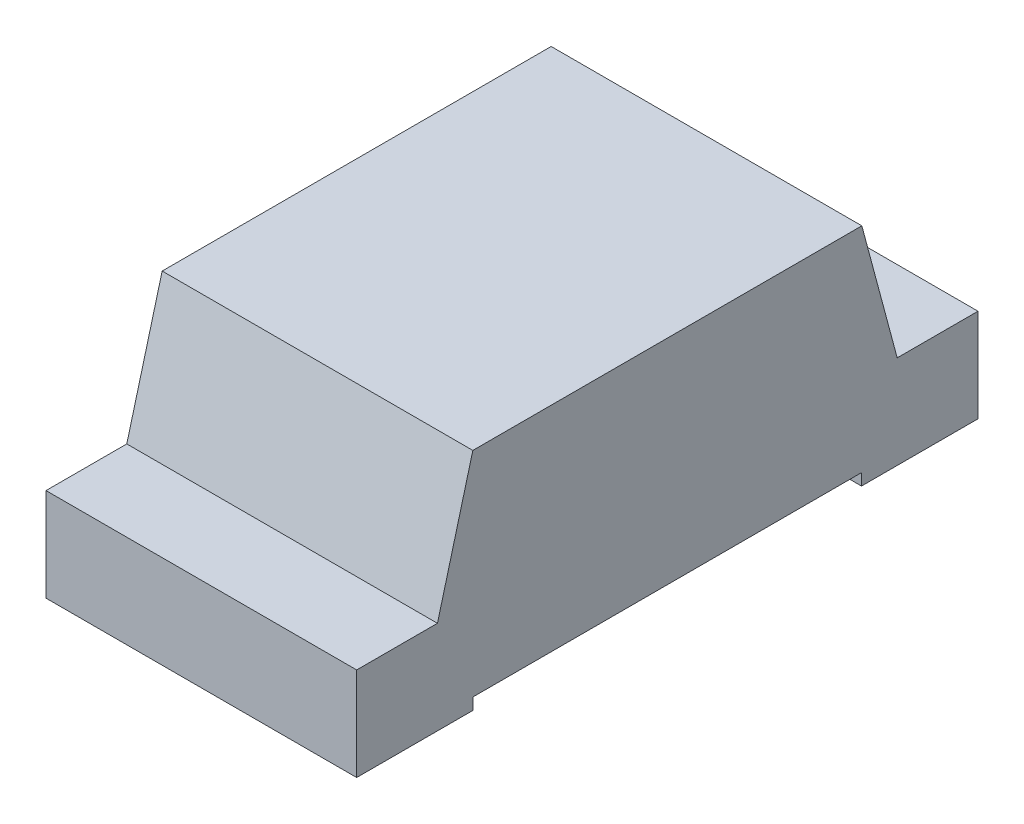
ISO-10303-21;
HEADER;
FILE_DESCRIPTION(('STEP AP214'),'2;1');
FILE_NAME('part.step','',(''),(''),'','','');
FILE_SCHEMA(('AUTOMOTIVE_DESIGN { 1 0 10303 214 1 1 1 1 }'));
ENDSEC;
DATA;
#1=APPLICATION_CONTEXT('core data for automotive mechanical design processes');
#2=APPLICATION_PROTOCOL_DEFINITION('international standard','automotive_design',2000,#1);
#3=PRODUCT_CONTEXT('',#1,'mechanical');
#4=PRODUCT('Part','Part','',(#3));
#5=PRODUCT_RELATED_PRODUCT_CATEGORY('part','',(#4));
#6=PRODUCT_DEFINITION_FORMATION('','',#4);
#7=PRODUCT_DEFINITION_CONTEXT('part definition',#1,'design');
#8=PRODUCT_DEFINITION('design','',#6,#7);
#9=PRODUCT_DEFINITION_SHAPE('','',#8);
#10=(LENGTH_UNIT() NAMED_UNIT(*) SI_UNIT(.MILLI.,.METRE.));
#11=(NAMED_UNIT(*) PLANE_ANGLE_UNIT() SI_UNIT($,.RADIAN.));
#12=(NAMED_UNIT(*) SI_UNIT($,.STERADIAN.) SOLID_ANGLE_UNIT());
#13=UNCERTAINTY_MEASURE_WITH_UNIT(LENGTH_MEASURE(1.E-05),#10,'distance_accuracy_value','');
#14=(GEOMETRIC_REPRESENTATION_CONTEXT(3) GLOBAL_UNCERTAINTY_ASSIGNED_CONTEXT((#13)) GLOBAL_UNIT_ASSIGNED_CONTEXT((#10,
#11,#12)) REPRESENTATION_CONTEXT('',''));
#15=CARTESIAN_POINT('',(0.,0.,0.));
#16=DIRECTION('',(0.,0.,1.));
#17=DIRECTION('',(1.,0.,0.));
#18=AXIS2_PLACEMENT_3D('',#15,#16,#17);
#19=CARTESIAN_POINT('',(0.4,0.,-0.5));
#20=DIRECTION('',(0.,1.,0.));
#21=DIRECTION('',(0.,0.,1.));
#22=AXIS2_PLACEMENT_3D('',#19,#20,#21);
#23=PLANE('',#22);
#24=DIRECTION('',(1.,0.,0.));
#25=VECTOR('',#24,1.);
#26=CARTESIAN_POINT('',(0.4,0.,-0.8));
#27=LINE('',#26,#25);
#28=CARTESIAN_POINT('',(-0.4,0.,-0.8));
#29=VERTEX_POINT('',#28);
#30=CARTESIAN_POINT('',(0.4,0.,-0.8));
#31=VERTEX_POINT('',#30);
#32=EDGE_CURVE('E19',#29,#31,#27,.T.);
#33=ORIENTED_EDGE('',*,*,#32,.T.);
#34=DIRECTION('',(0.,0.,-1.));
#35=VECTOR('',#34,1.);
#36=CARTESIAN_POINT('',(0.4,0.,0.));
#37=LINE('',#36,#35);
#38=CARTESIAN_POINT('',(0.4,0.,-0.5));
#39=VERTEX_POINT('',#38);
#40=EDGE_CURVE('E122',#39,#31,#37,.T.);
#41=ORIENTED_EDGE('',*,*,#40,.F.);
#42=DIRECTION('',(-1.,0.,0.));
#43=VECTOR('',#42,1.);
#44=CARTESIAN_POINT('',(0.4,0.,-0.5));
#45=LINE('',#44,#43);
#46=CARTESIAN_POINT('',(-0.4,0.,-0.5));
#47=VERTEX_POINT('',#46);
#48=EDGE_CURVE('E109',#39,#47,#45,.T.);
#49=ORIENTED_EDGE('',*,*,#48,.T.);
#50=DIRECTION('',(0.,0.,-1.));
#51=VECTOR('',#50,1.);
#52=CARTESIAN_POINT('',(-0.4,0.,0.));
#53=LINE('',#52,#51);
#54=EDGE_CURVE('E177',#47,#29,#53,.T.);
#55=ORIENTED_EDGE('',*,*,#54,.T.);
#56=EDGE_LOOP('',(#33,#41,#49,#55));
#57=FACE_BOUND('',#56,.T.);
#58=ADVANCED_FACE('F16',(#57),#23,.F.);
#59=CARTESIAN_POINT('',(0.4,0.,-0.8));
#60=DIRECTION('',(0.,0.,1.));
#61=DIRECTION('',(0.,-1.,0.));
#62=AXIS2_PLACEMENT_3D('',#59,#60,#61);
#63=PLANE('',#62);
#64=DIRECTION('',(1.,0.,0.));
#65=VECTOR('',#64,1.);
#66=CARTESIAN_POINT('',(0.4,0.24,-0.8));
#67=LINE('',#66,#65);
#68=CARTESIAN_POINT('',(-0.4,0.24,-0.8));
#69=VERTEX_POINT('',#68);
#70=CARTESIAN_POINT('',(0.4,0.24,-0.8));
#71=VERTEX_POINT('',#70);
#72=EDGE_CURVE('E147',#69,#71,#67,.T.);
#73=ORIENTED_EDGE('',*,*,#72,.T.);
#74=DIRECTION('',(0.,1.,0.));
#75=VECTOR('',#74,1.);
#76=CARTESIAN_POINT('',(0.4,0.,-0.8));
#77=LINE('',#76,#75);
#78=EDGE_CURVE('E127',#31,#71,#77,.T.);
#79=ORIENTED_EDGE('',*,*,#78,.F.);
#80=ORIENTED_EDGE('',*,*,#32,.F.);
#81=DIRECTION('',(0.,1.,0.));
#82=VECTOR('',#81,1.);
#83=CARTESIAN_POINT('',(-0.4,0.,-0.8));
#84=LINE('',#83,#82);
#85=EDGE_CURVE('E154',#29,#69,#84,.T.);
#86=ORIENTED_EDGE('',*,*,#85,.T.);
#87=EDGE_LOOP('',(#73,#79,#80,#86));
#88=FACE_BOUND('',#87,.T.);
#89=ADVANCED_FACE('F152',(#88),#63,.F.);
#90=CARTESIAN_POINT('',(0.4,0.24,-0.8));
#91=DIRECTION('',(0.,-1.,0.));
#92=DIRECTION('',(0.,0.,-1.));
#93=AXIS2_PLACEMENT_3D('',#90,#91,#92);
#94=PLANE('',#93);
#95=DIRECTION('',(1.,0.,0.));
#96=VECTOR('',#95,1.);
#97=CARTESIAN_POINT('',(0.4,0.24,-0.591961524227066));
#98=LINE('',#97,#96);
#99=CARTESIAN_POINT('',(-0.4,0.24,-0.591961524227066));
#100=VERTEX_POINT('',#99);
#101=CARTESIAN_POINT('',(0.4,0.24,-0.591961524227066));
#102=VERTEX_POINT('',#101);
#103=EDGE_CURVE('E118',#100,#102,#98,.T.);
#104=ORIENTED_EDGE('',*,*,#103,.T.);
#105=DIRECTION('',(0.,0.,-1.));
#106=VECTOR('',#105,1.);
#107=CARTESIAN_POINT('',(0.4,0.24,0.));
#108=LINE('',#107,#106);
#109=EDGE_CURVE('E129',#71,#102,#108,.F.);
#110=ORIENTED_EDGE('',*,*,#109,.F.);
#111=ORIENTED_EDGE('',*,*,#72,.F.);
#112=DIRECTION('',(0.,0.,-1.));
#113=VECTOR('',#112,1.);
#114=CARTESIAN_POINT('',(-0.4,0.24,0.));
#115=LINE('',#114,#113);
#116=EDGE_CURVE('E180',#69,#100,#115,.F.);
#117=ORIENTED_EDGE('',*,*,#116,.T.);
#118=EDGE_LOOP('',(#104,#110,#111,#117));
#119=FACE_BOUND('',#118,.T.);
#120=ADVANCED_FACE('F158',(#119),#94,.F.);
#121=CARTESIAN_POINT('',(0.4,0.24,0.8));
#122=DIRECTION('',(0.,-1.,0.));
#123=DIRECTION('',(0.,0.,-1.));
#124=AXIS2_PLACEMENT_3D('',#121,#122,#123);
#125=PLANE('',#124);
#126=DIRECTION('',(1.,0.,0.));
#127=VECTOR('',#126,1.);
#128=CARTESIAN_POINT('',(0.4,0.24,0.8));
#129=LINE('',#128,#127);
#130=CARTESIAN_POINT('',(-0.4,0.24,0.8));
#131=VERTEX_POINT('',#130);
#132=CARTESIAN_POINT('',(0.4,0.24,0.8));
#133=VERTEX_POINT('',#132);
#134=EDGE_CURVE('E145',#131,#133,#129,.T.);
#135=ORIENTED_EDGE('',*,*,#134,.T.);
#136=DIRECTION('',(0.,0.,-1.));
#137=VECTOR('',#136,1.);
#138=CARTESIAN_POINT('',(0.4,0.24,0.));
#139=LINE('',#138,#137);
#140=CARTESIAN_POINT('',(0.4,0.24,0.591961524227066));
#141=VERTEX_POINT('',#140);
#142=EDGE_CURVE('E161',#141,#133,#139,.F.);
#143=ORIENTED_EDGE('',*,*,#142,.F.);
#144=DIRECTION('',(1.,0.,0.));
#145=VECTOR('',#144,1.);
#146=CARTESIAN_POINT('',(0.4,0.24,0.591961524227066));
#147=LINE('',#146,#145);
#148=CARTESIAN_POINT('',(-0.4,0.24,0.591961524227066));
#149=VERTEX_POINT('',#148);
#150=EDGE_CURVE('E175',#141,#149,#147,.F.);
#151=ORIENTED_EDGE('',*,*,#150,.T.);
#152=DIRECTION('',(0.,0.,-1.));
#153=VECTOR('',#152,1.);
#154=CARTESIAN_POINT('',(-0.4,0.24,0.));
#155=LINE('',#154,#153);
#156=EDGE_CURVE('E186',#149,#131,#155,.F.);
#157=ORIENTED_EDGE('',*,*,#156,.T.);
#158=EDGE_LOOP('',(#135,#143,#151,#157));
#159=FACE_BOUND('',#158,.T.);
#160=ADVANCED_FACE('F251',(#159),#125,.F.);
#161=CARTESIAN_POINT('',(0.4,0.,0.8));
#162=DIRECTION('',(0.,0.,-1.));
#163=DIRECTION('',(0.,1.,0.));
#164=AXIS2_PLACEMENT_3D('',#161,#162,#163);
#165=PLANE('',#164);
#166=DIRECTION('',(1.,0.,0.));
#167=VECTOR('',#166,1.);
#168=CARTESIAN_POINT('',(0.4,0.,0.8));
#169=LINE('',#168,#167);
#170=CARTESIAN_POINT('',(-0.4,0.,0.8));
#171=VERTEX_POINT('',#170);
#172=CARTESIAN_POINT('',(0.4,0.,0.8));
#173=VERTEX_POINT('',#172);
#174=EDGE_CURVE('E142',#171,#173,#169,.T.);
#175=ORIENTED_EDGE('',*,*,#174,.T.);
#176=DIRECTION('',(0.,1.,0.));
#177=VECTOR('',#176,1.);
#178=CARTESIAN_POINT('',(0.4,0.,0.8));
#179=LINE('',#178,#177);
#180=EDGE_CURVE('E165',#133,#173,#179,.F.);
#181=ORIENTED_EDGE('',*,*,#180,.F.);
#182=ORIENTED_EDGE('',*,*,#134,.F.);
#183=DIRECTION('',(0.,1.,0.));
#184=VECTOR('',#183,1.);
#185=CARTESIAN_POINT('',(-0.4,0.,0.8));
#186=LINE('',#185,#184);
#187=EDGE_CURVE('E189',#131,#171,#186,.F.);
#188=ORIENTED_EDGE('',*,*,#187,.T.);
#189=EDGE_LOOP('',(#175,#181,#182,#188));
#190=FACE_BOUND('',#189,.T.);
#191=ADVANCED_FACE('F247',(#190),#165,.F.);
#192=CARTESIAN_POINT('',(0.4,0.,0.5));
#193=DIRECTION('',(0.,1.,0.));
#194=DIRECTION('',(0.,0.,1.));
#195=AXIS2_PLACEMENT_3D('',#192,#193,#194);
#196=PLANE('',#195);
#197=DIRECTION('',(1.,0.,0.));
#198=VECTOR('',#197,1.);
#199=CARTESIAN_POINT('',(0.4,0.,0.5));
#200=LINE('',#199,#198);
#201=CARTESIAN_POINT('',(-0.4,0.,0.5));
#202=VERTEX_POINT('',#201);
#203=CARTESIAN_POINT('',(0.4,0.,0.5));
#204=VERTEX_POINT('',#203);
#205=EDGE_CURVE('E139',#202,#204,#200,.T.);
#206=ORIENTED_EDGE('',*,*,#205,.T.);
#207=DIRECTION('',(0.,0.,-1.));
#208=VECTOR('',#207,1.);
#209=CARTESIAN_POINT('',(0.4,0.,0.));
#210=LINE('',#209,#208);
#211=EDGE_CURVE('E167',#173,#204,#210,.T.);
#212=ORIENTED_EDGE('',*,*,#211,.F.);
#213=ORIENTED_EDGE('',*,*,#174,.F.);
#214=DIRECTION('',(0.,0.,-1.));
#215=VECTOR('',#214,1.);
#216=CARTESIAN_POINT('',(-0.4,0.,0.));
#217=LINE('',#216,#215);
#218=EDGE_CURVE('E192',#171,#202,#217,.T.);
#219=ORIENTED_EDGE('',*,*,#218,.T.);
#220=EDGE_LOOP('',(#206,#212,#213,#219));
#221=FACE_BOUND('',#220,.T.);
#222=ADVANCED_FACE('F243',(#221),#196,.F.);
#223=CARTESIAN_POINT('',(0.4,0.03,0.5));
#224=DIRECTION('',(0.,0.,1.));
#225=DIRECTION('',(1.,0.,0.));
#226=AXIS2_PLACEMENT_3D('',#223,#224,#225);
#227=PLANE('',#226);
#228=DIRECTION('',(1.,0.,0.));
#229=VECTOR('',#228,1.);
#230=CARTESIAN_POINT('',(0.4,0.03,0.5));
#231=LINE('',#230,#229);
#232=CARTESIAN_POINT('',(-0.4,0.03,0.5));
#233=VERTEX_POINT('',#232);
#234=CARTESIAN_POINT('',(0.4,0.03,0.5));
#235=VERTEX_POINT('',#234);
#236=EDGE_CURVE('E136',#233,#235,#231,.T.);
#237=ORIENTED_EDGE('',*,*,#236,.T.);
#238=DIRECTION('',(0.,1.,0.));
#239=VECTOR('',#238,1.);
#240=CARTESIAN_POINT('',(0.4,0.,0.5));
#241=LINE('',#240,#239);
#242=EDGE_CURVE('E169',#204,#235,#241,.T.);
#243=ORIENTED_EDGE('',*,*,#242,.F.);
#244=ORIENTED_EDGE('',*,*,#205,.F.);
#245=DIRECTION('',(0.,1.,0.));
#246=VECTOR('',#245,1.);
#247=CARTESIAN_POINT('',(-0.4,0.,0.5));
#248=LINE('',#247,#246);
#249=EDGE_CURVE('E195',#202,#233,#248,.T.);
#250=ORIENTED_EDGE('',*,*,#249,.T.);
#251=EDGE_LOOP('',(#237,#243,#244,#250));
#252=FACE_BOUND('',#251,.T.);
#253=ADVANCED_FACE('F240',(#252),#227,.F.);
#254=CARTESIAN_POINT('',(0.4,0.03,-0.5));
#255=DIRECTION('',(0.,1.,0.));
#256=DIRECTION('',(0.,0.,1.));
#257=AXIS2_PLACEMENT_3D('',#254,#255,#256);
#258=PLANE('',#257);
#259=DIRECTION('',(-1.,0.,0.));
#260=VECTOR('',#259,1.);
#261=CARTESIAN_POINT('',(0.4,0.03,-0.5));
#262=LINE('',#261,#260);
#263=CARTESIAN_POINT('',(-0.4,0.03,-0.5));
#264=VERTEX_POINT('',#263);
#265=CARTESIAN_POINT('',(0.4,0.03,-0.5));
#266=VERTEX_POINT('',#265);
#267=EDGE_CURVE('E102',#264,#266,#262,.F.);
#268=ORIENTED_EDGE('',*,*,#267,.T.);
#269=DIRECTION('',(0.,0.,-1.));
#270=VECTOR('',#269,1.);
#271=CARTESIAN_POINT('',(0.4,0.03,0.));
#272=LINE('',#271,#270);
#273=EDGE_CURVE('E124',#235,#266,#272,.T.);
#274=ORIENTED_EDGE('',*,*,#273,.F.);
#275=ORIENTED_EDGE('',*,*,#236,.F.);
#276=DIRECTION('',(0.,0.,-1.));
#277=VECTOR('',#276,1.);
#278=CARTESIAN_POINT('',(-0.4,0.03,0.));
#279=LINE('',#278,#277);
#280=EDGE_CURVE('E198',#233,#264,#279,.T.);
#281=ORIENTED_EDGE('',*,*,#280,.T.);
#282=EDGE_LOOP('',(#268,#274,#275,#281));
#283=FACE_BOUND('',#282,.T.);
#284=ADVANCED_FACE('F237',(#283),#258,.F.);
#285=CARTESIAN_POINT('',(0.4,0.03,-0.5));
#286=DIRECTION('',(0.,0.,-1.));
#287=DIRECTION('',(-1.,0.,0.));
#288=AXIS2_PLACEMENT_3D('',#285,#286,#287);
#289=PLANE('',#288);
#290=ORIENTED_EDGE('',*,*,#48,.F.);
#291=DIRECTION('',(0.,1.,0.));
#292=VECTOR('',#291,1.);
#293=CARTESIAN_POINT('',(0.4,0.,-0.5));
#294=LINE('',#293,#292);
#295=EDGE_CURVE('E112',#266,#39,#294,.F.);
#296=ORIENTED_EDGE('',*,*,#295,.F.);
#297=ORIENTED_EDGE('',*,*,#267,.F.);
#298=DIRECTION('',(0.,1.,0.));
#299=VECTOR('',#298,1.);
#300=CARTESIAN_POINT('',(-0.4,0.,-0.5));
#301=LINE('',#300,#299);
#302=EDGE_CURVE('E114',#264,#47,#301,.F.);
#303=ORIENTED_EDGE('',*,*,#302,.T.);
#304=EDGE_LOOP('',(#290,#296,#297,#303));
#305=FACE_BOUND('',#304,.T.);
#306=ADVANCED_FACE('F111',(#305),#289,.F.);
#307=CARTESIAN_POINT('',(0.4,0.24,-0.591961524227066));
#308=DIRECTION('',(0.,-0.258819045102521,0.965925826289068));
#309=DIRECTION('',(0.,-0.965925826289068,-0.258819045102521));
#310=AXIS2_PLACEMENT_3D('',#307,#308,#309);
#311=PLANE('',#310);
#312=DIRECTION('',(1.,0.,0.));
#313=VECTOR('',#312,1.);
#314=CARTESIAN_POINT('',(0.4,0.58,-0.500858798800484));
#315=LINE('',#314,#313);
#316=CARTESIAN_POINT('',(-0.4,0.58,-0.500858798800484));
#317=VERTEX_POINT('',#316);
#318=CARTESIAN_POINT('',(0.4,0.58,-0.500858798800484));
#319=VERTEX_POINT('',#318);
#320=EDGE_CURVE('E201',#317,#319,#315,.T.);
#321=ORIENTED_EDGE('',*,*,#320,.T.);
#322=DIRECTION('',(0.,0.965925826289068,0.258819045102521));
#323=VECTOR('',#322,1.);
#324=CARTESIAN_POINT('',(0.4,0.24,-0.591961524227066));
#325=LINE('',#324,#323);
#326=EDGE_CURVE('E160',#102,#319,#325,.T.);
#327=ORIENTED_EDGE('',*,*,#326,.F.);
#328=ORIENTED_EDGE('',*,*,#103,.F.);
#329=DIRECTION('',(0.,0.965925826289068,0.258819045102521));
#330=VECTOR('',#329,1.);
#331=CARTESIAN_POINT('',(-0.4,0.24,-0.591961524227066));
#332=LINE('',#331,#330);
#333=EDGE_CURVE('E182',#100,#317,#332,.T.);
#334=ORIENTED_EDGE('',*,*,#333,.T.);
#335=EDGE_LOOP('',(#321,#327,#328,#334));
#336=FACE_BOUND('',#335,.T.);
#337=ADVANCED_FACE('F216',(#336),#311,.F.);
#338=CARTESIAN_POINT('',(0.4,0.,0.));
#339=DIRECTION('',(1.,0.,0.));
#340=DIRECTION('',(0.,0.,-1.));
#341=AXIS2_PLACEMENT_3D('',#338,#339,#340);
#342=PLANE('',#341);
#343=ORIENTED_EDGE('',*,*,#242,.T.);
#344=ORIENTED_EDGE('',*,*,#273,.T.);
#345=ORIENTED_EDGE('',*,*,#295,.T.);
#346=ORIENTED_EDGE('',*,*,#40,.T.);
#347=ORIENTED_EDGE('',*,*,#78,.T.);
#348=ORIENTED_EDGE('',*,*,#109,.T.);
#349=ORIENTED_EDGE('',*,*,#326,.T.);
#350=DIRECTION('',(0.,0.,-1.));
#351=VECTOR('',#350,1.);
#352=CARTESIAN_POINT('',(0.4,0.58,-0.500858798800484));
#353=LINE('',#352,#351);
#354=CARTESIAN_POINT('',(0.4,0.58,0.500858798800484));
#355=VERTEX_POINT('',#354);
#356=EDGE_CURVE('E204',#319,#355,#353,.F.);
#357=ORIENTED_EDGE('',*,*,#356,.T.);
#358=DIRECTION('',(0.,0.965925826289068,-0.258819045102521));
#359=VECTOR('',#358,1.);
#360=CARTESIAN_POINT('',(0.4,0.24,0.591961524227066));
#361=LINE('',#360,#359);
#362=EDGE_CURVE('E172',#355,#141,#361,.F.);
#363=ORIENTED_EDGE('',*,*,#362,.T.);
#364=ORIENTED_EDGE('',*,*,#142,.T.);
#365=ORIENTED_EDGE('',*,*,#180,.T.);
#366=ORIENTED_EDGE('',*,*,#211,.T.);
#367=EDGE_LOOP('',(#343,#344,#345,#346,#347,#348,#349,#357,#363,#364,#365,#366));
#368=FACE_BOUND('',#367,.T.);
#369=ADVANCED_FACE('F121',(#368),#342,.T.);
#370=CARTESIAN_POINT('',(0.4,0.24,0.591961524227066));
#371=DIRECTION('',(0.,-0.258819045102521,-0.965925826289068));
#372=DIRECTION('',(0.,0.965925826289068,-0.258819045102521));
#373=AXIS2_PLACEMENT_3D('',#370,#371,#372);
#374=PLANE('',#373);
#375=ORIENTED_EDGE('',*,*,#150,.F.);
#376=ORIENTED_EDGE('',*,*,#362,.F.);
#377=DIRECTION('',(1.,0.,0.));
#378=VECTOR('',#377,1.);
#379=CARTESIAN_POINT('',(0.4,0.58,0.500858798800484));
#380=LINE('',#379,#378);
#381=CARTESIAN_POINT('',(-0.4,0.58,0.500858798800484));
#382=VERTEX_POINT('',#381);
#383=EDGE_CURVE('E25',#355,#382,#380,.F.);
#384=ORIENTED_EDGE('',*,*,#383,.T.);
#385=DIRECTION('',(0.,-0.965925826289068,0.258819045102521));
#386=VECTOR('',#385,1.);
#387=CARTESIAN_POINT('',(-0.4,0.58,0.500858798800484));
#388=LINE('',#387,#386);
#389=EDGE_CURVE('E33',#382,#149,#388,.T.);
#390=ORIENTED_EDGE('',*,*,#389,.T.);
#391=EDGE_LOOP('',(#375,#376,#384,#390));
#392=FACE_BOUND('',#391,.T.);
#393=ADVANCED_FACE('F211',(#392),#374,.F.);
#394=CARTESIAN_POINT('',(-0.4,0.,0.));
#395=DIRECTION('',(1.,0.,0.));
#396=DIRECTION('',(0.,0.,-1.));
#397=AXIS2_PLACEMENT_3D('',#394,#395,#396);
#398=PLANE('',#397);
#399=ORIENTED_EDGE('',*,*,#280,.F.);
#400=ORIENTED_EDGE('',*,*,#249,.F.);
#401=ORIENTED_EDGE('',*,*,#218,.F.);
#402=ORIENTED_EDGE('',*,*,#187,.F.);
#403=ORIENTED_EDGE('',*,*,#156,.F.);
#404=ORIENTED_EDGE('',*,*,#389,.F.);
#405=DIRECTION('',(0.,0.,-1.));
#406=VECTOR('',#405,1.);
#407=CARTESIAN_POINT('',(-0.4,0.58,-0.500858798800484));
#408=LINE('',#407,#406);
#409=EDGE_CURVE('E11',#382,#317,#408,.T.);
#410=ORIENTED_EDGE('',*,*,#409,.T.);
#411=ORIENTED_EDGE('',*,*,#333,.F.);
#412=ORIENTED_EDGE('',*,*,#116,.F.);
#413=ORIENTED_EDGE('',*,*,#85,.F.);
#414=ORIENTED_EDGE('',*,*,#54,.F.);
#415=ORIENTED_EDGE('',*,*,#302,.F.);
#416=EDGE_LOOP('',(#399,#400,#401,#402,#403,#404,#410,#411,#412,#413,#414,#415));
#417=FACE_BOUND('',#416,.T.);
#418=ADVANCED_FACE('F219',(#417),#398,.F.);
#419=CARTESIAN_POINT('',(0.4,0.58,-0.500858798800484));
#420=DIRECTION('',(0.,-1.,0.));
#421=DIRECTION('',(0.,0.,-1.));
#422=AXIS2_PLACEMENT_3D('',#419,#420,#421);
#423=PLANE('',#422);
#424=ORIENTED_EDGE('',*,*,#383,.F.);
#425=ORIENTED_EDGE('',*,*,#356,.F.);
#426=ORIENTED_EDGE('',*,*,#320,.F.);
#427=ORIENTED_EDGE('',*,*,#409,.F.);
#428=EDGE_LOOP('',(#424,#425,#426,#427));
#429=FACE_BOUND('',#428,.T.);
#430=ADVANCED_FACE('F214',(#429),#423,.F.);
#431=CLOSED_SHELL('',(#58,#89,#120,#160,#191,#222,#253,#284,#306,#337,#369,#393,#418,#430));
#432=MANIFOLD_SOLID_BREP('B1',#431);
#433=ADVANCED_BREP_SHAPE_REPRESENTATION('',(#18,#432),#14);
#434=SHAPE_DEFINITION_REPRESENTATION(#9,#433);
ENDSEC;
END-ISO-10303-21;
